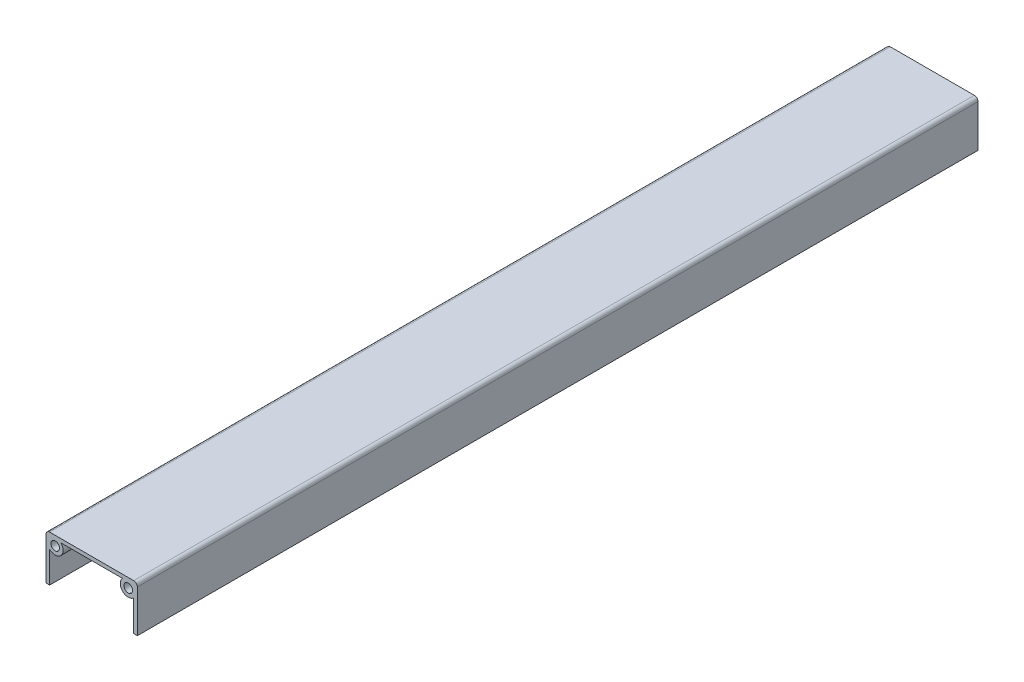
ISO-10303-21;
HEADER;
FILE_DESCRIPTION(('STEP AP214'),'2;1');
FILE_NAME('part.step','',(''),(''),'','','');
FILE_SCHEMA(('AUTOMOTIVE_DESIGN { 1 0 10303 214 1 1 1 1 }'));
ENDSEC;
DATA;
#1=APPLICATION_CONTEXT('core data for automotive mechanical design processes');
#2=APPLICATION_PROTOCOL_DEFINITION('international standard','automotive_design',2000,#1);
#3=PRODUCT_CONTEXT('',#1,'mechanical');
#4=PRODUCT('Part','Part','',(#3));
#5=PRODUCT_RELATED_PRODUCT_CATEGORY('part','',(#4));
#6=PRODUCT_DEFINITION_FORMATION('','',#4);
#7=PRODUCT_DEFINITION_CONTEXT('part definition',#1,'design');
#8=PRODUCT_DEFINITION('design','',#6,#7);
#9=PRODUCT_DEFINITION_SHAPE('','',#8);
#10=(LENGTH_UNIT() NAMED_UNIT(*) SI_UNIT(.MILLI.,.METRE.));
#11=(NAMED_UNIT(*) PLANE_ANGLE_UNIT() SI_UNIT($,.RADIAN.));
#12=(NAMED_UNIT(*) SI_UNIT($,.STERADIAN.) SOLID_ANGLE_UNIT());
#13=UNCERTAINTY_MEASURE_WITH_UNIT(LENGTH_MEASURE(1.E-05),#10,'distance_accuracy_value','');
#14=(GEOMETRIC_REPRESENTATION_CONTEXT(3) GLOBAL_UNCERTAINTY_ASSIGNED_CONTEXT((#13)) GLOBAL_UNIT_ASSIGNED_CONTEXT((#10,
#11,#12)) REPRESENTATION_CONTEXT('',''));
#15=CARTESIAN_POINT('',(0.,0.,0.));
#16=DIRECTION('',(0.,0.,1.));
#17=DIRECTION('',(1.,0.,0.));
#18=AXIS2_PLACEMENT_3D('',#15,#16,#17);
#19=CARTESIAN_POINT('',(0.,0.,292.1));
#20=DIRECTION('',(0.,0.,-1.));
#21=DIRECTION('',(-1.,0.,0.));
#22=AXIS2_PLACEMENT_3D('',#19,#20,#21);
#23=PLANE('',#22);
#24=DIRECTION('',(0.,-1.,0.));
#25=VECTOR('',#24,1.);
#26=CARTESIAN_POINT('',(-31.75,-31.75,292.1));
#27=LINE('',#26,#25);
#28=CARTESIAN_POINT('',(-31.75,29.21,292.1));
#29=VERTEX_POINT('',#28);
#30=CARTESIAN_POINT('',(-31.75,-0.128852466554086,292.1));
#31=VERTEX_POINT('',#30);
#32=EDGE_CURVE('E160',#29,#31,#27,.T.);
#33=ORIENTED_EDGE('',*,*,#32,.T.);
#34=DIRECTION('',(-1.,0.,0.));
#35=VECTOR('',#34,1.);
#36=CARTESIAN_POINT('',(-31.75,-0.128852466554086,292.1));
#37=LINE('',#36,#35);
#38=CARTESIAN_POINT('',(-29.21,-0.128852466554086,292.1));
#39=VERTEX_POINT('',#38);
#40=EDGE_CURVE('E124',#39,#31,#37,.T.);
#41=ORIENTED_EDGE('',*,*,#40,.F.);
#42=DIRECTION('',(0.,-1.,0.));
#43=VECTOR('',#42,1.);
#44=CARTESIAN_POINT('',(-29.21,0.,292.1));
#45=LINE('',#44,#43);
#46=CARTESIAN_POINT('',(-29.21,21.3781223290607,292.1));
#47=VERTEX_POINT('',#46);
#48=EDGE_CURVE('E219',#47,#39,#45,.T.);
#49=ORIENTED_EDGE('',*,*,#48,.F.);
#50=CARTESIAN_POINT('',(-25.4,25.4,292.1));
#51=DIRECTION('',(0.,0.,-1.));
#52=DIRECTION('',(-1.,0.,0.));
#53=AXIS2_PLACEMENT_3D('',#50,#51,#52);
#54=CIRCLE('',#53,5.53999999999999);
#55=CARTESIAN_POINT('',(-21.3781223290607,29.21,292.1));
#56=VERTEX_POINT('',#55);
#57=EDGE_CURVE('E222',#47,#56,#54,.F.);
#58=ORIENTED_EDGE('',*,*,#57,.T.);
#59=DIRECTION('',(-1.,0.,0.));
#60=VECTOR('',#59,1.);
#61=CARTESIAN_POINT('',(0.,29.21,292.1));
#62=LINE('',#61,#60);
#63=CARTESIAN_POINT('',(21.3781223290607,29.21,292.1));
#64=VERTEX_POINT('',#63);
#65=EDGE_CURVE('E240',#64,#56,#62,.T.);
#66=ORIENTED_EDGE('',*,*,#65,.F.);
#67=CARTESIAN_POINT('',(25.4,25.4,292.1));
#68=DIRECTION('',(0.,0.,-1.));
#69=DIRECTION('',(-1.,0.,0.));
#70=AXIS2_PLACEMENT_3D('',#67,#68,#69);
#71=CIRCLE('',#70,5.53999999999999);
#72=CARTESIAN_POINT('',(29.21,21.3781223290607,292.1));
#73=VERTEX_POINT('',#72);
#74=EDGE_CURVE('E223',#64,#73,#71,.F.);
#75=ORIENTED_EDGE('',*,*,#74,.T.);
#76=DIRECTION('',(0.,1.,0.));
#77=VECTOR('',#76,1.);
#78=CARTESIAN_POINT('',(29.21,0.,292.1));
#79=LINE('',#78,#77);
#80=CARTESIAN_POINT('',(29.21,-0.128852466554086,292.1));
#81=VERTEX_POINT('',#80);
#82=EDGE_CURVE('E236',#81,#73,#79,.T.);
#83=ORIENTED_EDGE('',*,*,#82,.F.);
#84=CARTESIAN_POINT('',(31.75,-0.128852466554086,292.1));
#85=VERTEX_POINT('',#84);
#86=EDGE_CURVE('E50',#85,#81,#37,.T.);
#87=ORIENTED_EDGE('',*,*,#86,.F.);
#88=DIRECTION('',(0.,1.,0.));
#89=VECTOR('',#88,1.);
#90=CARTESIAN_POINT('',(31.75,-31.75,292.1));
#91=LINE('',#90,#89);
#92=CARTESIAN_POINT('',(31.75,29.21,292.1));
#93=VERTEX_POINT('',#92);
#94=EDGE_CURVE('E146',#85,#93,#91,.T.);
#95=ORIENTED_EDGE('',*,*,#94,.T.);
#96=CARTESIAN_POINT('',(29.21,29.21,292.1));
#97=DIRECTION('',(0.,0.,-1.));
#98=DIRECTION('',(-1.,0.,0.));
#99=AXIS2_PLACEMENT_3D('',#96,#97,#98);
#100=CIRCLE('',#99,2.54);
#101=CARTESIAN_POINT('',(29.21,31.75,292.1));
#102=VERTEX_POINT('',#101);
#103=EDGE_CURVE('E163',#93,#102,#100,.F.);
#104=ORIENTED_EDGE('',*,*,#103,.T.);
#105=DIRECTION('',(-1.,0.,0.));
#106=VECTOR('',#105,1.);
#107=CARTESIAN_POINT('',(-31.75,31.75,292.1));
#108=LINE('',#107,#106);
#109=CARTESIAN_POINT('',(-29.21,31.75,292.1));
#110=VERTEX_POINT('',#109);
#111=EDGE_CURVE('E149',#102,#110,#108,.T.);
#112=ORIENTED_EDGE('',*,*,#111,.T.);
#113=CARTESIAN_POINT('',(-29.21,29.21,292.1));
#114=DIRECTION('',(0.,0.,-1.));
#115=DIRECTION('',(-1.,0.,0.));
#116=AXIS2_PLACEMENT_3D('',#113,#114,#115);
#117=CIRCLE('',#116,2.54);
#118=EDGE_CURVE('E165',#110,#29,#117,.F.);
#119=ORIENTED_EDGE('',*,*,#118,.T.);
#120=EDGE_LOOP('',(#33,#41,#49,#58,#66,#75,#83,#87,#95,#104,#112,#119));
#121=FACE_BOUND('',#120,.T.);
#122=CARTESIAN_POINT('',(-25.4,25.4,292.1));
#123=DIRECTION('',(0.,0.,1.));
#124=DIRECTION('',(1.,0.,0.));
#125=AXIS2_PLACEMENT_3D('',#122,#123,#124);
#126=CIRCLE('',#125,2.99999999999999);
#127=CARTESIAN_POINT('',(-22.4,25.4,292.1));
#128=VERTEX_POINT('',#127);
#129=EDGE_CURVE('E195',#128,#128,#126,.T.);
#130=ORIENTED_EDGE('',*,*,#129,.F.);
#131=EDGE_LOOP('',(#130));
#132=FACE_BOUND('',#131,.T.);
#133=CARTESIAN_POINT('',(25.4,25.4,292.1));
#134=DIRECTION('',(0.,0.,1.));
#135=DIRECTION('',(-1.,0.,0.));
#136=AXIS2_PLACEMENT_3D('',#133,#134,#135);
#137=CIRCLE('',#136,2.99999999999999);
#138=CARTESIAN_POINT('',(22.4,25.4,292.1));
#139=VERTEX_POINT('',#138);
#140=EDGE_CURVE('E202',#139,#139,#137,.T.);
#141=ORIENTED_EDGE('',*,*,#140,.F.);
#142=EDGE_LOOP('',(#141));
#143=FACE_BOUND('',#142,.T.);
#144=ADVANCED_FACE('F35',(#121,#132,#143),#23,.F.);
#145=CARTESIAN_POINT('',(0.,0.,-292.1));
#146=DIRECTION('',(0.,0.,-1.));
#147=DIRECTION('',(-1.,0.,0.));
#148=AXIS2_PLACEMENT_3D('',#145,#146,#147);
#149=PLANE('',#148);
#150=DIRECTION('',(-1.,0.,0.));
#151=VECTOR('',#150,1.);
#152=CARTESIAN_POINT('',(-31.75,-0.128852466554086,-292.1));
#153=LINE('',#152,#151);
#154=CARTESIAN_POINT('',(-29.21,-0.128852466554086,-292.1));
#155=VERTEX_POINT('',#154);
#156=CARTESIAN_POINT('',(-31.75,-0.128852466554086,-292.1));
#157=VERTEX_POINT('',#156);
#158=EDGE_CURVE('E57',#155,#157,#153,.T.);
#159=ORIENTED_EDGE('',*,*,#158,.T.);
#160=DIRECTION('',(0.,-1.,0.));
#161=VECTOR('',#160,1.);
#162=CARTESIAN_POINT('',(-31.75,-31.75,-292.1));
#163=LINE('',#162,#161);
#164=CARTESIAN_POINT('',(-31.75,29.21,-292.1));
#165=VERTEX_POINT('',#164);
#166=EDGE_CURVE('E137',#165,#157,#163,.T.);
#167=ORIENTED_EDGE('',*,*,#166,.F.);
#168=CARTESIAN_POINT('',(-29.21,29.21,-292.1));
#169=DIRECTION('',(0.,0.,-1.));
#170=DIRECTION('',(-1.,0.,0.));
#171=AXIS2_PLACEMENT_3D('',#168,#169,#170);
#172=CIRCLE('',#171,2.54);
#173=CARTESIAN_POINT('',(-29.21,31.75,-292.1));
#174=VERTEX_POINT('',#173);
#175=EDGE_CURVE('E159',#165,#174,#172,.T.);
#176=ORIENTED_EDGE('',*,*,#175,.T.);
#177=DIRECTION('',(-1.,0.,0.));
#178=VECTOR('',#177,1.);
#179=CARTESIAN_POINT('',(-31.75,31.75,-292.1));
#180=LINE('',#179,#178);
#181=CARTESIAN_POINT('',(29.21,31.75,-292.1));
#182=VERTEX_POINT('',#181);
#183=EDGE_CURVE('E147',#182,#174,#180,.T.);
#184=ORIENTED_EDGE('',*,*,#183,.F.);
#185=CARTESIAN_POINT('',(29.21,29.21,-292.1));
#186=DIRECTION('',(0.,0.,-1.));
#187=DIRECTION('',(-1.,0.,0.));
#188=AXIS2_PLACEMENT_3D('',#185,#186,#187);
#189=CIRCLE('',#188,2.54);
#190=CARTESIAN_POINT('',(31.75,29.21,-292.1));
#191=VERTEX_POINT('',#190);
#192=EDGE_CURVE('E156',#182,#191,#189,.T.);
#193=ORIENTED_EDGE('',*,*,#192,.T.);
#194=DIRECTION('',(0.,1.,0.));
#195=VECTOR('',#194,1.);
#196=CARTESIAN_POINT('',(31.75,-31.75,-292.1));
#197=LINE('',#196,#195);
#198=CARTESIAN_POINT('',(31.75,-0.128852466554086,-292.1));
#199=VERTEX_POINT('',#198);
#200=EDGE_CURVE('E152',#199,#191,#197,.T.);
#201=ORIENTED_EDGE('',*,*,#200,.F.);
#202=CARTESIAN_POINT('',(29.21,-0.128852466554086,-292.1));
#203=VERTEX_POINT('',#202);
#204=EDGE_CURVE('E130',#199,#203,#153,.T.);
#205=ORIENTED_EDGE('',*,*,#204,.T.);
#206=DIRECTION('',(0.,1.,0.));
#207=VECTOR('',#206,1.);
#208=CARTESIAN_POINT('',(29.21,0.,-292.1));
#209=LINE('',#208,#207);
#210=CARTESIAN_POINT('',(29.21,21.3781223290607,-292.1));
#211=VERTEX_POINT('',#210);
#212=EDGE_CURVE('E226',#203,#211,#209,.T.);
#213=ORIENTED_EDGE('',*,*,#212,.T.);
#214=CARTESIAN_POINT('',(25.4,25.4,-292.1));
#215=DIRECTION('',(0.,0.,-1.));
#216=DIRECTION('',(-1.,0.,0.));
#217=AXIS2_PLACEMENT_3D('',#214,#215,#216);
#218=CIRCLE('',#217,5.53999999999999);
#219=CARTESIAN_POINT('',(21.3781223290607,29.21,-292.1));
#220=VERTEX_POINT('',#219);
#221=EDGE_CURVE('E227',#220,#211,#218,.F.);
#222=ORIENTED_EDGE('',*,*,#221,.F.);
#223=DIRECTION('',(-1.,0.,0.));
#224=VECTOR('',#223,1.);
#225=CARTESIAN_POINT('',(0.,29.21,-292.1));
#226=LINE('',#225,#224);
#227=CARTESIAN_POINT('',(-21.3781223290607,29.21,-292.1));
#228=VERTEX_POINT('',#227);
#229=EDGE_CURVE('E232',#220,#228,#226,.T.);
#230=ORIENTED_EDGE('',*,*,#229,.T.);
#231=CARTESIAN_POINT('',(-25.4,25.4,-292.1));
#232=DIRECTION('',(0.,0.,-1.));
#233=DIRECTION('',(-1.,0.,0.));
#234=AXIS2_PLACEMENT_3D('',#231,#232,#233);
#235=CIRCLE('',#234,5.53999999999999);
#236=CARTESIAN_POINT('',(-29.21,21.3781223290607,-292.1));
#237=VERTEX_POINT('',#236);
#238=EDGE_CURVE('E220',#237,#228,#235,.F.);
#239=ORIENTED_EDGE('',*,*,#238,.F.);
#240=DIRECTION('',(0.,-1.,0.));
#241=VECTOR('',#240,1.);
#242=CARTESIAN_POINT('',(-29.21,0.,-292.1));
#243=LINE('',#242,#241);
#244=EDGE_CURVE('E140',#237,#155,#243,.T.);
#245=ORIENTED_EDGE('',*,*,#244,.T.);
#246=EDGE_LOOP('',(#159,#167,#176,#184,#193,#201,#205,#213,#222,#230,#239,#245));
#247=FACE_BOUND('',#246,.T.);
#248=CARTESIAN_POINT('',(-25.4,25.4,-292.1));
#249=DIRECTION('',(0.,0.,1.));
#250=DIRECTION('',(1.,0.,0.));
#251=AXIS2_PLACEMENT_3D('',#248,#249,#250);
#252=CIRCLE('',#251,2.99999999999999);
#253=CARTESIAN_POINT('',(-22.4,25.4,-292.1));
#254=VERTEX_POINT('',#253);
#255=EDGE_CURVE('E197',#254,#254,#252,.T.);
#256=ORIENTED_EDGE('',*,*,#255,.T.);
#257=EDGE_LOOP('',(#256));
#258=FACE_BOUND('',#257,.T.);
#259=CARTESIAN_POINT('',(25.4,25.4,-292.1));
#260=DIRECTION('',(0.,0.,1.));
#261=DIRECTION('',(-1.,0.,0.));
#262=AXIS2_PLACEMENT_3D('',#259,#260,#261);
#263=CIRCLE('',#262,2.99999999999999);
#264=CARTESIAN_POINT('',(22.4,25.4,-292.1));
#265=VERTEX_POINT('',#264);
#266=EDGE_CURVE('E204',#265,#265,#263,.T.);
#267=ORIENTED_EDGE('',*,*,#266,.T.);
#268=EDGE_LOOP('',(#267));
#269=FACE_BOUND('',#268,.T.);
#270=ADVANCED_FACE('F135',(#247,#258,#269),#149,.T.);
#271=CARTESIAN_POINT('',(31.75,-31.75,292.1));
#272=DIRECTION('',(-1.,0.,0.));
#273=DIRECTION('',(0.,0.,1.));
#274=AXIS2_PLACEMENT_3D('',#271,#272,#273);
#275=PLANE('',#274);
#276=ORIENTED_EDGE('',*,*,#94,.F.);
#277=DIRECTION('',(0.,0.,-1.));
#278=VECTOR('',#277,1.);
#279=CARTESIAN_POINT('',(31.75,-0.128852466554086,292.1));
#280=LINE('',#279,#278);
#281=EDGE_CURVE('E194',#85,#199,#280,.T.);
#282=ORIENTED_EDGE('',*,*,#281,.T.);
#283=ORIENTED_EDGE('',*,*,#200,.T.);
#284=DIRECTION('',(0.,0.,-1.));
#285=VECTOR('',#284,1.);
#286=CARTESIAN_POINT('',(31.75,29.21,292.1));
#287=LINE('',#286,#285);
#288=EDGE_CURVE('E167',#191,#93,#287,.F.);
#289=ORIENTED_EDGE('',*,*,#288,.T.);
#290=EDGE_LOOP('',(#276,#282,#283,#289));
#291=FACE_BOUND('',#290,.T.);
#292=ADVANCED_FACE('F192',(#291),#275,.F.);
#293=CARTESIAN_POINT('',(-31.75,31.75,292.1));
#294=DIRECTION('',(0.,-1.,0.));
#295=DIRECTION('',(0.,0.,-1.));
#296=AXIS2_PLACEMENT_3D('',#293,#294,#295);
#297=PLANE('',#296);
#298=ORIENTED_EDGE('',*,*,#183,.T.);
#299=DIRECTION('',(0.,0.,-1.));
#300=VECTOR('',#299,1.);
#301=CARTESIAN_POINT('',(-29.21,31.75,292.1));
#302=LINE('',#301,#300);
#303=EDGE_CURVE('E43',#174,#110,#302,.F.);
#304=ORIENTED_EDGE('',*,*,#303,.T.);
#305=ORIENTED_EDGE('',*,*,#111,.F.);
#306=DIRECTION('',(0.,0.,-1.));
#307=VECTOR('',#306,1.);
#308=CARTESIAN_POINT('',(29.21,31.75,292.1));
#309=LINE('',#308,#307);
#310=EDGE_CURVE('E170',#102,#182,#309,.T.);
#311=ORIENTED_EDGE('',*,*,#310,.T.);
#312=EDGE_LOOP('',(#298,#304,#305,#311));
#313=FACE_BOUND('',#312,.T.);
#314=ADVANCED_FACE('F176',(#313),#297,.F.);
#315=CARTESIAN_POINT('',(-31.75,-31.75,292.1));
#316=DIRECTION('',(1.,0.,0.));
#317=DIRECTION('',(0.,0.,-1.));
#318=AXIS2_PLACEMENT_3D('',#315,#316,#317);
#319=PLANE('',#318);
#320=ORIENTED_EDGE('',*,*,#166,.T.);
#321=DIRECTION('',(0.,0.,1.));
#322=VECTOR('',#321,1.);
#323=CARTESIAN_POINT('',(-31.75,-0.128852466554086,-292.1));
#324=LINE('',#323,#322);
#325=EDGE_CURVE('E121',#157,#31,#324,.T.);
#326=ORIENTED_EDGE('',*,*,#325,.T.);
#327=ORIENTED_EDGE('',*,*,#32,.F.);
#328=DIRECTION('',(0.,0.,-1.));
#329=VECTOR('',#328,1.);
#330=CARTESIAN_POINT('',(-31.75,29.21,292.1));
#331=LINE('',#330,#329);
#332=EDGE_CURVE('E145',#29,#165,#331,.T.);
#333=ORIENTED_EDGE('',*,*,#332,.T.);
#334=EDGE_LOOP('',(#320,#326,#327,#333));
#335=FACE_BOUND('',#334,.T.);
#336=ADVANCED_FACE('F143',(#335),#319,.F.);
#337=CARTESIAN_POINT('',(-25.4,25.4,292.1));
#338=DIRECTION('',(0.,0.,-1.));
#339=DIRECTION('',(-1.,0.,0.));
#340=AXIS2_PLACEMENT_3D('',#337,#338,#339);
#341=CYLINDRICAL_SURFACE('',#340,2.99999999999999);
#342=ORIENTED_EDGE('',*,*,#129,.T.);
#343=EDGE_LOOP('',(#342));
#344=FACE_BOUND('',#343,.T.);
#345=ORIENTED_EDGE('',*,*,#255,.F.);
#346=EDGE_LOOP('',(#345));
#347=FACE_BOUND('',#346,.T.);
#348=ADVANCED_FACE('F281',(#344,#347),#341,.F.);
#349=CARTESIAN_POINT('',(25.4,25.4,292.1));
#350=DIRECTION('',(0.,0.,-1.));
#351=DIRECTION('',(-1.,0.,0.));
#352=AXIS2_PLACEMENT_3D('',#349,#350,#351);
#353=CYLINDRICAL_SURFACE('',#352,2.99999999999999);
#354=ORIENTED_EDGE('',*,*,#140,.T.);
#355=EDGE_LOOP('',(#354));
#356=FACE_BOUND('',#355,.T.);
#357=ORIENTED_EDGE('',*,*,#266,.F.);
#358=EDGE_LOOP('',(#357));
#359=FACE_BOUND('',#358,.T.);
#360=ADVANCED_FACE('F290',(#356,#359),#353,.F.);
#361=CARTESIAN_POINT('',(-29.21,29.21,292.1));
#362=DIRECTION('',(0.,0.,-1.));
#363=DIRECTION('',(-1.,0.,0.));
#364=AXIS2_PLACEMENT_3D('',#361,#362,#363);
#365=CYLINDRICAL_SURFACE('',#364,2.54);
#366=ORIENTED_EDGE('',*,*,#118,.F.);
#367=ORIENTED_EDGE('',*,*,#303,.F.);
#368=ORIENTED_EDGE('',*,*,#175,.F.);
#369=ORIENTED_EDGE('',*,*,#332,.F.);
#370=EDGE_LOOP('',(#366,#367,#368,#369));
#371=FACE_BOUND('',#370,.T.);
#372=ADVANCED_FACE('F185',(#371),#365,.T.);
#373=CARTESIAN_POINT('',(29.21,29.21,292.1));
#374=DIRECTION('',(0.,0.,-1.));
#375=DIRECTION('',(-1.,0.,0.));
#376=AXIS2_PLACEMENT_3D('',#373,#374,#375);
#377=CYLINDRICAL_SURFACE('',#376,2.54);
#378=ORIENTED_EDGE('',*,*,#103,.F.);
#379=ORIENTED_EDGE('',*,*,#288,.F.);
#380=ORIENTED_EDGE('',*,*,#192,.F.);
#381=ORIENTED_EDGE('',*,*,#310,.F.);
#382=EDGE_LOOP('',(#378,#379,#380,#381));
#383=FACE_BOUND('',#382,.T.);
#384=ADVANCED_FACE('F37',(#383),#377,.T.);
#385=CARTESIAN_POINT('',(29.21,-31.75,292.1));
#386=DIRECTION('',(-1.,0.,0.));
#387=DIRECTION('',(0.,0.,1.));
#388=AXIS2_PLACEMENT_3D('',#385,#386,#387);
#389=PLANE('',#388);
#390=DIRECTION('',(0.,0.,-1.));
#391=VECTOR('',#390,1.);
#392=CARTESIAN_POINT('',(29.21,-0.128852466554086,292.1));
#393=LINE('',#392,#391);
#394=EDGE_CURVE('E129',#81,#203,#393,.T.);
#395=ORIENTED_EDGE('',*,*,#394,.F.);
#396=ORIENTED_EDGE('',*,*,#82,.T.);
#397=DIRECTION('',(0.,0.,-1.));
#398=VECTOR('',#397,1.);
#399=CARTESIAN_POINT('',(29.21,21.3781223290607,292.1));
#400=LINE('',#399,#398);
#401=EDGE_CURVE('E216',#73,#211,#400,.T.);
#402=ORIENTED_EDGE('',*,*,#401,.T.);
#403=ORIENTED_EDGE('',*,*,#212,.F.);
#404=EDGE_LOOP('',(#395,#396,#402,#403));
#405=FACE_BOUND('',#404,.T.);
#406=ADVANCED_FACE('F251',(#405),#389,.T.);
#407=CARTESIAN_POINT('',(-31.75,29.21,292.1));
#408=DIRECTION('',(0.,-1.,0.));
#409=DIRECTION('',(0.,0.,-1.));
#410=AXIS2_PLACEMENT_3D('',#407,#408,#409);
#411=PLANE('',#410);
#412=DIRECTION('',(0.,0.,-1.));
#413=VECTOR('',#412,1.);
#414=CARTESIAN_POINT('',(-21.3781223290607,29.21,292.1));
#415=LINE('',#414,#413);
#416=EDGE_CURVE('E207',#56,#228,#415,.T.);
#417=ORIENTED_EDGE('',*,*,#416,.T.);
#418=ORIENTED_EDGE('',*,*,#229,.F.);
#419=DIRECTION('',(0.,0.,-1.));
#420=VECTOR('',#419,1.);
#421=CARTESIAN_POINT('',(21.3781223290607,29.21,292.1));
#422=LINE('',#421,#420);
#423=EDGE_CURVE('E214',#64,#220,#422,.T.);
#424=ORIENTED_EDGE('',*,*,#423,.F.);
#425=ORIENTED_EDGE('',*,*,#65,.T.);
#426=EDGE_LOOP('',(#417,#418,#424,#425));
#427=FACE_BOUND('',#426,.T.);
#428=ADVANCED_FACE('F258',(#427),#411,.T.);
#429=CARTESIAN_POINT('',(-29.21,-31.75,292.1));
#430=DIRECTION('',(1.,0.,0.));
#431=DIRECTION('',(0.,0.,-1.));
#432=AXIS2_PLACEMENT_3D('',#429,#430,#431);
#433=PLANE('',#432);
#434=DIRECTION('',(0.,0.,1.));
#435=VECTOR('',#434,1.);
#436=CARTESIAN_POINT('',(-29.21,-0.128852466554086,292.1));
#437=LINE('',#436,#435);
#438=EDGE_CURVE('E11',#155,#39,#437,.T.);
#439=ORIENTED_EDGE('',*,*,#438,.F.);
#440=ORIENTED_EDGE('',*,*,#244,.F.);
#441=DIRECTION('',(0.,0.,-1.));
#442=VECTOR('',#441,1.);
#443=CARTESIAN_POINT('',(-29.21,21.3781223290607,292.1));
#444=LINE('',#443,#442);
#445=EDGE_CURVE('E212',#47,#237,#444,.T.);
#446=ORIENTED_EDGE('',*,*,#445,.F.);
#447=ORIENTED_EDGE('',*,*,#48,.T.);
#448=EDGE_LOOP('',(#439,#440,#446,#447));
#449=FACE_BOUND('',#448,.T.);
#450=ADVANCED_FACE('F265',(#449),#433,.T.);
#451=CARTESIAN_POINT('',(-25.4,25.4,292.1));
#452=DIRECTION('',(0.,0.,-1.));
#453=DIRECTION('',(-1.,0.,0.));
#454=AXIS2_PLACEMENT_3D('',#451,#452,#453);
#455=CYLINDRICAL_SURFACE('',#454,5.53999999999999);
#456=ORIENTED_EDGE('',*,*,#57,.F.);
#457=ORIENTED_EDGE('',*,*,#445,.T.);
#458=ORIENTED_EDGE('',*,*,#238,.T.);
#459=ORIENTED_EDGE('',*,*,#416,.F.);
#460=EDGE_LOOP('',(#456,#457,#458,#459));
#461=FACE_BOUND('',#460,.T.);
#462=ADVANCED_FACE('F262',(#461),#455,.T.);
#463=CARTESIAN_POINT('',(25.4,25.4,292.1));
#464=DIRECTION('',(0.,0.,-1.));
#465=DIRECTION('',(-1.,0.,0.));
#466=AXIS2_PLACEMENT_3D('',#463,#464,#465);
#467=CYLINDRICAL_SURFACE('',#466,5.53999999999999);
#468=ORIENTED_EDGE('',*,*,#423,.T.);
#469=ORIENTED_EDGE('',*,*,#221,.T.);
#470=ORIENTED_EDGE('',*,*,#401,.F.);
#471=ORIENTED_EDGE('',*,*,#74,.F.);
#472=EDGE_LOOP('',(#468,#469,#470,#471));
#473=FACE_BOUND('',#472,.T.);
#474=ADVANCED_FACE('F255',(#473),#467,.T.);
#475=CARTESIAN_POINT('',(-31.75,-0.128852466554086,-292.1));
#476=DIRECTION('',(0.,1.,0.));
#477=DIRECTION('',(0.,0.,1.));
#478=AXIS2_PLACEMENT_3D('',#475,#476,#477);
#479=PLANE('',#478);
#480=ORIENTED_EDGE('',*,*,#438,.T.);
#481=ORIENTED_EDGE('',*,*,#40,.T.);
#482=ORIENTED_EDGE('',*,*,#325,.F.);
#483=ORIENTED_EDGE('',*,*,#158,.F.);
#484=EDGE_LOOP('',(#480,#481,#482,#483));
#485=FACE_BOUND('',#484,.T.);
#486=ADVANCED_FACE('F122',(#485),#479,.F.);
#487=ORIENTED_EDGE('',*,*,#86,.T.);
#488=ORIENTED_EDGE('',*,*,#394,.T.);
#489=ORIENTED_EDGE('',*,*,#204,.F.);
#490=ORIENTED_EDGE('',*,*,#281,.F.);
#491=EDGE_LOOP('',(#487,#488,#489,#490));
#492=FACE_BOUND('',#491,.T.);
#493=ADVANCED_FACE('F246',(#492),#479,.F.);
#494=CLOSED_SHELL('',(#144,#270,#292,#314,#336,#348,#360,#372,#384,#406,#428,#450,#462,#474,
#486,#493));
#495=MANIFOLD_SOLID_BREP('B2',#494);
#496=ADVANCED_BREP_SHAPE_REPRESENTATION('',(#18,#495),#14);
#497=SHAPE_DEFINITION_REPRESENTATION(#9,#496);
ENDSEC;
END-ISO-10303-21;
